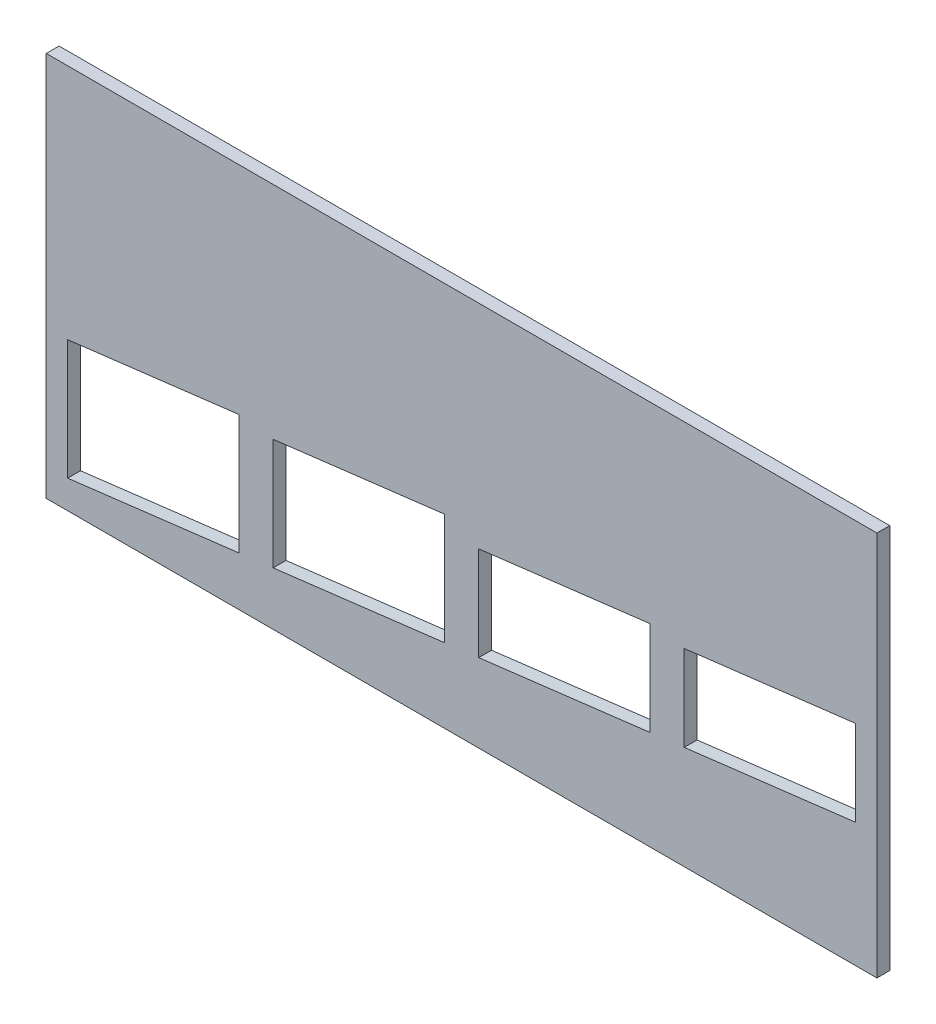
ISO-10303-21;
HEADER;
FILE_DESCRIPTION(('STEP AP214'),'2;1');
FILE_NAME('part.step','',(''),(''),'','','');
FILE_SCHEMA(('AUTOMOTIVE_DESIGN { 1 0 10303 214 1 1 1 1 }'));
ENDSEC;
DATA;
#1=APPLICATION_CONTEXT('core data for automotive mechanical design processes');
#2=APPLICATION_PROTOCOL_DEFINITION('international standard','automotive_design',2000,#1);
#3=PRODUCT_CONTEXT('',#1,'mechanical');
#4=PRODUCT('Part','Part','',(#3));
#5=PRODUCT_RELATED_PRODUCT_CATEGORY('part','',(#4));
#6=PRODUCT_DEFINITION_FORMATION('','',#4);
#7=PRODUCT_DEFINITION_CONTEXT('part definition',#1,'design');
#8=PRODUCT_DEFINITION('design','',#6,#7);
#9=PRODUCT_DEFINITION_SHAPE('','',#8);
#10=(LENGTH_UNIT() NAMED_UNIT(*) SI_UNIT(.MILLI.,.METRE.));
#11=(NAMED_UNIT(*) PLANE_ANGLE_UNIT() SI_UNIT($,.RADIAN.));
#12=(NAMED_UNIT(*) SI_UNIT($,.STERADIAN.) SOLID_ANGLE_UNIT());
#13=UNCERTAINTY_MEASURE_WITH_UNIT(LENGTH_MEASURE(1.E-05),#10,'distance_accuracy_value','');
#14=(GEOMETRIC_REPRESENTATION_CONTEXT(3) GLOBAL_UNCERTAINTY_ASSIGNED_CONTEXT((#13)) GLOBAL_UNIT_ASSIGNED_CONTEXT((#10,
#11,#12)) REPRESENTATION_CONTEXT('',''));
#15=CARTESIAN_POINT('',(0.,0.,0.));
#16=DIRECTION('',(0.,0.,1.));
#17=DIRECTION('',(1.,0.,0.));
#18=AXIS2_PLACEMENT_3D('',#15,#16,#17);
#19=CARTESIAN_POINT('',(0.,45.0091370558375,3.));
#20=DIRECTION('',(0.,1.,0.));
#21=DIRECTION('',(0.,0.,1.));
#22=AXIS2_PLACEMENT_3D('',#19,#20,#21);
#23=PLANE('',#22);
#24=DIRECTION('',(1.,0.,0.));
#25=VECTOR('',#24,1.);
#26=CARTESIAN_POINT('',(0.,45.0091370558375,0.));
#27=LINE('',#26,#25);
#28=CARTESIAN_POINT('',(-98.5,45.0091370558375,0.));
#29=VERTEX_POINT('',#28);
#30=CARTESIAN_POINT('',(95.5,45.0091370558375,0.));
#31=VERTEX_POINT('',#30);
#32=EDGE_CURVE('E292',#29,#31,#27,.T.);
#33=ORIENTED_EDGE('',*,*,#32,.F.);
#34=DIRECTION('',(0.,0.,-1.));
#35=VECTOR('',#34,1.);
#36=CARTESIAN_POINT('',(-98.5,45.0091370558375,3.));
#37=LINE('',#36,#35);
#38=CARTESIAN_POINT('',(-98.5,45.0091370558375,3.));
#39=VERTEX_POINT('',#38);
#40=EDGE_CURVE('E11',#39,#29,#37,.T.);
#41=ORIENTED_EDGE('',*,*,#40,.F.);
#42=DIRECTION('',(1.,0.,0.));
#43=VECTOR('',#42,1.);
#44=CARTESIAN_POINT('',(0.,45.0091370558375,3.));
#45=LINE('',#44,#43);
#46=CARTESIAN_POINT('',(95.5,45.0091370558375,3.));
#47=VERTEX_POINT('',#46);
#48=EDGE_CURVE('E191',#39,#47,#45,.T.);
#49=ORIENTED_EDGE('',*,*,#48,.T.);
#50=DIRECTION('',(0.,0.,-1.));
#51=VECTOR('',#50,1.);
#52=CARTESIAN_POINT('',(95.5,45.0091370558375,3.));
#53=LINE('',#52,#51);
#54=EDGE_CURVE('E52',#47,#31,#53,.T.);
#55=ORIENTED_EDGE('',*,*,#54,.T.);
#56=EDGE_LOOP('',(#33,#41,#49,#55));
#57=FACE_BOUND('',#56,.T.);
#58=ADVANCED_FACE('F33',(#57),#23,.T.);
#59=CARTESIAN_POINT('',(-98.5,0.,3.));
#60=DIRECTION('',(1.,0.,0.));
#61=DIRECTION('',(0.,0.,-1.));
#62=AXIS2_PLACEMENT_3D('',#59,#60,#61);
#63=PLANE('',#62);
#64=DIRECTION('',(0.,-1.,0.));
#65=VECTOR('',#64,1.);
#66=CARTESIAN_POINT('',(-98.5,0.,0.));
#67=LINE('',#66,#65);
#68=CARTESIAN_POINT('',(-98.5,-44.9908629441625,0.));
#69=VERTEX_POINT('',#68);
#70=EDGE_CURVE('E196',#29,#69,#67,.T.);
#71=ORIENTED_EDGE('',*,*,#70,.T.);
#72=DIRECTION('',(0.,0.,-1.));
#73=VECTOR('',#72,1.);
#74=CARTESIAN_POINT('',(-98.5,-44.9908629441625,3.));
#75=LINE('',#74,#73);
#76=CARTESIAN_POINT('',(-98.5,-44.9908629441625,3.));
#77=VERTEX_POINT('',#76);
#78=EDGE_CURVE('E43',#77,#69,#75,.T.);
#79=ORIENTED_EDGE('',*,*,#78,.F.);
#80=DIRECTION('',(0.,-1.,0.));
#81=VECTOR('',#80,1.);
#82=CARTESIAN_POINT('',(-98.5,0.,3.));
#83=LINE('',#82,#81);
#84=EDGE_CURVE('E186',#39,#77,#83,.T.);
#85=ORIENTED_EDGE('',*,*,#84,.F.);
#86=ORIENTED_EDGE('',*,*,#40,.T.);
#87=EDGE_LOOP('',(#71,#79,#85,#86));
#88=FACE_BOUND('',#87,.T.);
#89=ADVANCED_FACE('F194',(#88),#63,.F.);
#90=CARTESIAN_POINT('',(0.,-44.9908629441625,3.));
#91=DIRECTION('',(0.,1.,0.));
#92=DIRECTION('',(-1.,0.,0.));
#93=AXIS2_PLACEMENT_3D('',#90,#91,#92);
#94=PLANE('',#93);
#95=DIRECTION('',(1.,0.,0.));
#96=VECTOR('',#95,1.);
#97=CARTESIAN_POINT('',(0.,-44.9908629441625,0.));
#98=LINE('',#97,#96);
#99=CARTESIAN_POINT('',(95.5,-44.9908629441625,0.));
#100=VERTEX_POINT('',#99);
#101=EDGE_CURVE('E295',#69,#100,#98,.T.);
#102=ORIENTED_EDGE('',*,*,#101,.T.);
#103=DIRECTION('',(0.,0.,-1.));
#104=VECTOR('',#103,1.);
#105=CARTESIAN_POINT('',(95.5,-44.9908629441625,3.));
#106=LINE('',#105,#104);
#107=CARTESIAN_POINT('',(95.5,-44.9908629441625,3.));
#108=VERTEX_POINT('',#107);
#109=EDGE_CURVE('E114',#108,#100,#106,.T.);
#110=ORIENTED_EDGE('',*,*,#109,.F.);
#111=DIRECTION('',(1.,0.,0.));
#112=VECTOR('',#111,1.);
#113=CARTESIAN_POINT('',(0.,-44.9908629441625,3.));
#114=LINE('',#113,#112);
#115=EDGE_CURVE('E178',#77,#108,#114,.T.);
#116=ORIENTED_EDGE('',*,*,#115,.F.);
#117=ORIENTED_EDGE('',*,*,#78,.T.);
#118=EDGE_LOOP('',(#102,#110,#116,#117));
#119=FACE_BOUND('',#118,.T.);
#120=ADVANCED_FACE('F180',(#119),#94,.F.);
#121=CARTESIAN_POINT('',(-93.5,0.,3.));
#122=DIRECTION('',(-1.,0.,0.));
#123=DIRECTION('',(0.,0.,1.));
#124=AXIS2_PLACEMENT_3D('',#121,#122,#123);
#125=PLANE('',#124);
#126=DIRECTION('',(0.,1.,0.));
#127=VECTOR('',#126,1.);
#128=CARTESIAN_POINT('',(-93.5,0.,0.));
#129=LINE('',#128,#127);
#130=CARTESIAN_POINT('',(-93.5,-38.3908629441625,0.));
#131=VERTEX_POINT('',#130);
#132=CARTESIAN_POINT('',(-93.5,-10.3908629441625,0.));
#133=VERTEX_POINT('',#132);
#134=EDGE_CURVE('E280',#131,#133,#129,.T.);
#135=ORIENTED_EDGE('',*,*,#134,.T.);
#136=DIRECTION('',(0.,0.,-1.));
#137=VECTOR('',#136,1.);
#138=CARTESIAN_POINT('',(-93.5,-10.3908629441625,3.));
#139=LINE('',#138,#137);
#140=CARTESIAN_POINT('',(-93.5,-10.3908629441625,3.));
#141=VERTEX_POINT('',#140);
#142=EDGE_CURVE('E208',#141,#133,#139,.T.);
#143=ORIENTED_EDGE('',*,*,#142,.F.);
#144=DIRECTION('',(0.,1.,0.));
#145=VECTOR('',#144,1.);
#146=CARTESIAN_POINT('',(-93.5,0.,3.));
#147=LINE('',#146,#145);
#148=CARTESIAN_POINT('',(-93.5,-38.3908629441625,3.));
#149=VERTEX_POINT('',#148);
#150=EDGE_CURVE('E333',#149,#141,#147,.T.);
#151=ORIENTED_EDGE('',*,*,#150,.F.);
#152=DIRECTION('',(0.,0.,-1.));
#153=VECTOR('',#152,1.);
#154=CARTESIAN_POINT('',(-93.5,-38.3908629441625,3.));
#155=LINE('',#154,#153);
#156=EDGE_CURVE('E201',#149,#131,#155,.T.);
#157=ORIENTED_EDGE('',*,*,#156,.T.);
#158=EDGE_LOOP('',(#135,#143,#151,#157));
#159=FACE_BOUND('',#158,.T.);
#160=ADVANCED_FACE('F380',(#159),#125,.F.);
#161=CARTESIAN_POINT('',(-0.120045702678682,0.98537514282085,3.));
#162=DIRECTION('',(-0.120933275731409,0.992660638295319,0.));
#163=DIRECTION('',(-0.992660638295319,-0.120933275731409,0.));
#164=AXIS2_PLACEMENT_3D('',#161,#162,#163);
#165=PLANE('',#164);
#166=DIRECTION('',(0.992660638295319,0.120933275731409,0.));
#167=VECTOR('',#166,1.);
#168=CARTESIAN_POINT('',(-0.120045702678682,0.98537514282085,0.));
#169=LINE('',#168,#167);
#170=CARTESIAN_POINT('',(-53.5,-5.51776649746195,0.));
#171=VERTEX_POINT('',#170);
#172=EDGE_CURVE('E283',#133,#171,#169,.T.);
#173=ORIENTED_EDGE('',*,*,#172,.T.);
#174=DIRECTION('',(0.,0.,-1.));
#175=VECTOR('',#174,1.);
#176=CARTESIAN_POINT('',(-53.5,-5.51776649746195,3.));
#177=LINE('',#176,#175);
#178=CARTESIAN_POINT('',(-53.5,-5.51776649746195,3.));
#179=VERTEX_POINT('',#178);
#180=EDGE_CURVE('E206',#179,#171,#177,.T.);
#181=ORIENTED_EDGE('',*,*,#180,.F.);
#182=DIRECTION('',(0.992660638295319,0.120933275731409,0.));
#183=VECTOR('',#182,1.);
#184=CARTESIAN_POINT('',(-0.120045702678682,0.98537514282085,3.));
#185=LINE('',#184,#183);
#186=EDGE_CURVE('E336',#141,#179,#185,.T.);
#187=ORIENTED_EDGE('',*,*,#186,.F.);
#188=ORIENTED_EDGE('',*,*,#142,.T.);
#189=EDGE_LOOP('',(#173,#181,#187,#188));
#190=FACE_BOUND('',#189,.T.);
#191=ADVANCED_FACE('F376',(#190),#165,.F.);
#192=CARTESIAN_POINT('',(-53.5,0.,3.));
#193=DIRECTION('',(-1.,0.,0.));
#194=DIRECTION('',(0.,-1.,0.));
#195=AXIS2_PLACEMENT_3D('',#192,#193,#194);
#196=PLANE('',#195);
#197=DIRECTION('',(0.,1.,0.));
#198=VECTOR('',#197,1.);
#199=CARTESIAN_POINT('',(-53.5,0.,0.));
#200=LINE('',#199,#198);
#201=CARTESIAN_POINT('',(-53.5,-33.5177664974619,0.));
#202=VERTEX_POINT('',#201);
#203=EDGE_CURVE('E286',#202,#171,#200,.T.);
#204=ORIENTED_EDGE('',*,*,#203,.F.);
#205=DIRECTION('',(0.,0.,-1.));
#206=VECTOR('',#205,1.);
#207=CARTESIAN_POINT('',(-53.5,-33.5177664974619,3.));
#208=LINE('',#207,#206);
#209=CARTESIAN_POINT('',(-53.5,-33.5177664974619,3.));
#210=VERTEX_POINT('',#209);
#211=EDGE_CURVE('E203',#210,#202,#208,.T.);
#212=ORIENTED_EDGE('',*,*,#211,.F.);
#213=DIRECTION('',(0.,1.,0.));
#214=VECTOR('',#213,1.);
#215=CARTESIAN_POINT('',(-53.5,0.,3.));
#216=LINE('',#215,#214);
#217=EDGE_CURVE('E338',#210,#179,#216,.T.);
#218=ORIENTED_EDGE('',*,*,#217,.T.);
#219=ORIENTED_EDGE('',*,*,#180,.T.);
#220=EDGE_LOOP('',(#204,#212,#218,#219));
#221=FACE_BOUND('',#220,.T.);
#222=ADVANCED_FACE('F372',(#221),#196,.T.);
#223=CARTESIAN_POINT('',(-45.5,0.,3.));
#224=DIRECTION('',(-1.,0.,0.));
#225=DIRECTION('',(0.,-1.,0.));
#226=AXIS2_PLACEMENT_3D('',#223,#224,#225);
#227=PLANE('',#226);
#228=DIRECTION('',(0.,1.,0.));
#229=VECTOR('',#228,1.);
#230=CARTESIAN_POINT('',(-45.5,0.,0.));
#231=LINE('',#230,#229);
#232=CARTESIAN_POINT('',(-45.5,-32.5431472081218,0.));
#233=VERTEX_POINT('',#232);
#234=CARTESIAN_POINT('',(-45.5,-6.54314720812184,0.));
#235=VERTEX_POINT('',#234);
#236=EDGE_CURVE('E268',#233,#235,#231,.T.);
#237=ORIENTED_EDGE('',*,*,#236,.T.);
#238=DIRECTION('',(0.,0.,-1.));
#239=VECTOR('',#238,1.);
#240=CARTESIAN_POINT('',(-45.5,-6.54314720812184,3.));
#241=LINE('',#240,#239);
#242=CARTESIAN_POINT('',(-45.5,-6.54314720812184,3.));
#243=VERTEX_POINT('',#242);
#244=EDGE_CURVE('E204',#243,#235,#241,.T.);
#245=ORIENTED_EDGE('',*,*,#244,.F.);
#246=DIRECTION('',(0.,1.,0.));
#247=VECTOR('',#246,1.);
#248=CARTESIAN_POINT('',(-45.5,0.,3.));
#249=LINE('',#248,#247);
#250=CARTESIAN_POINT('',(-45.5,-32.5431472081218,3.));
#251=VERTEX_POINT('',#250);
#252=EDGE_CURVE('E322',#251,#243,#249,.T.);
#253=ORIENTED_EDGE('',*,*,#252,.F.);
#254=DIRECTION('',(0.,0.,-1.));
#255=VECTOR('',#254,1.);
#256=CARTESIAN_POINT('',(-45.5,-32.5431472081218,3.));
#257=LINE('',#256,#255);
#258=EDGE_CURVE('E211',#251,#233,#257,.T.);
#259=ORIENTED_EDGE('',*,*,#258,.T.);
#260=EDGE_LOOP('',(#237,#245,#253,#259));
#261=FACE_BOUND('',#260,.T.);
#262=ADVANCED_FACE('F375',(#261),#227,.F.);
#263=CARTESIAN_POINT('',(0.120045702678687,-0.985375142820888,3.));
#264=DIRECTION('',(-0.120933275731409,0.992660638295319,0.));
#265=DIRECTION('',(-0.992660638295319,-0.120933275731409,0.));
#266=AXIS2_PLACEMENT_3D('',#263,#264,#265);
#267=PLANE('',#266);
#268=DIRECTION('',(0.992660638295319,0.120933275731409,0.));
#269=VECTOR('',#268,1.);
#270=CARTESIAN_POINT('',(0.120045702678687,-0.985375142820888,0.));
#271=LINE('',#270,#269);
#272=CARTESIAN_POINT('',(-5.49999999999999,-1.67005076142134,0.));
#273=VERTEX_POINT('',#272);
#274=EDGE_CURVE('E271',#235,#273,#271,.T.);
#275=ORIENTED_EDGE('',*,*,#274,.T.);
#276=DIRECTION('',(0.,0.,-1.));
#277=VECTOR('',#276,1.);
#278=CARTESIAN_POINT('',(-5.49999999999999,-1.67005076142134,3.));
#279=LINE('',#278,#277);
#280=CARTESIAN_POINT('',(-5.49999999999999,-1.67005076142134,3.));
#281=VERTEX_POINT('',#280);
#282=EDGE_CURVE('E216',#281,#273,#279,.T.);
#283=ORIENTED_EDGE('',*,*,#282,.F.);
#284=DIRECTION('',(0.992660638295319,0.120933275731409,0.));
#285=VECTOR('',#284,1.);
#286=CARTESIAN_POINT('',(0.120045702678687,-0.985375142820888,3.));
#287=LINE('',#286,#285);
#288=EDGE_CURVE('E325',#243,#281,#287,.T.);
#289=ORIENTED_EDGE('',*,*,#288,.F.);
#290=ORIENTED_EDGE('',*,*,#244,.T.);
#291=EDGE_LOOP('',(#275,#283,#289,#290));
#292=FACE_BOUND('',#291,.T.);
#293=ADVANCED_FACE('F392',(#292),#267,.F.);
#294=CARTESIAN_POINT('',(-5.49999999999999,0.,3.));
#295=DIRECTION('',(-1.,0.,0.));
#296=DIRECTION('',(0.,-1.,0.));
#297=AXIS2_PLACEMENT_3D('',#294,#295,#296);
#298=PLANE('',#297);
#299=DIRECTION('',(0.,1.,0.));
#300=VECTOR('',#299,1.);
#301=CARTESIAN_POINT('',(-5.49999999999999,0.,0.));
#302=LINE('',#301,#300);
#303=CARTESIAN_POINT('',(-5.49999999999998,-27.6700507614213,0.));
#304=VERTEX_POINT('',#303);
#305=EDGE_CURVE('E274',#304,#273,#302,.T.);
#306=ORIENTED_EDGE('',*,*,#305,.F.);
#307=DIRECTION('',(0.,0.,-1.));
#308=VECTOR('',#307,1.);
#309=CARTESIAN_POINT('',(-5.49999999999998,-27.6700507614213,3.));
#310=LINE('',#309,#308);
#311=CARTESIAN_POINT('',(-5.49999999999998,-27.6700507614213,3.));
#312=VERTEX_POINT('',#311);
#313=EDGE_CURVE('E213',#312,#304,#310,.T.);
#314=ORIENTED_EDGE('',*,*,#313,.F.);
#315=DIRECTION('',(0.,1.,0.));
#316=VECTOR('',#315,1.);
#317=CARTESIAN_POINT('',(-5.49999999999999,0.,3.));
#318=LINE('',#317,#316);
#319=EDGE_CURVE('E327',#312,#281,#318,.T.);
#320=ORIENTED_EDGE('',*,*,#319,.T.);
#321=ORIENTED_EDGE('',*,*,#282,.T.);
#322=EDGE_LOOP('',(#306,#314,#320,#321));
#323=FACE_BOUND('',#322,.T.);
#324=ADVANCED_FACE('F388',(#323),#298,.T.);
#325=CARTESIAN_POINT('',(2.50000000000001,0.,3.));
#326=DIRECTION('',(-1.,0.,0.));
#327=DIRECTION('',(0.,-1.,0.));
#328=AXIS2_PLACEMENT_3D('',#325,#326,#327);
#329=PLANE('',#328);
#330=DIRECTION('',(0.,1.,0.));
#331=VECTOR('',#330,1.);
#332=CARTESIAN_POINT('',(2.50000000000001,0.,0.));
#333=LINE('',#332,#331);
#334=CARTESIAN_POINT('',(2.50000000000002,-26.6954314720812,0.));
#335=VERTEX_POINT('',#334);
#336=CARTESIAN_POINT('',(2.50000000000001,-4.69543147208123,0.));
#337=VERTEX_POINT('',#336);
#338=EDGE_CURVE('E256',#335,#337,#333,.T.);
#339=ORIENTED_EDGE('',*,*,#338,.T.);
#340=DIRECTION('',(0.,0.,-1.));
#341=VECTOR('',#340,1.);
#342=CARTESIAN_POINT('',(2.50000000000001,-4.69543147208123,3.));
#343=LINE('',#342,#341);
#344=CARTESIAN_POINT('',(2.50000000000001,-4.69543147208123,3.));
#345=VERTEX_POINT('',#344);
#346=EDGE_CURVE('E214',#345,#337,#343,.T.);
#347=ORIENTED_EDGE('',*,*,#346,.F.);
#348=DIRECTION('',(0.,1.,0.));
#349=VECTOR('',#348,1.);
#350=CARTESIAN_POINT('',(2.50000000000001,0.,3.));
#351=LINE('',#350,#349);
#352=CARTESIAN_POINT('',(2.50000000000002,-26.6954314720812,3.));
#353=VERTEX_POINT('',#352);
#354=EDGE_CURVE('E311',#353,#345,#351,.T.);
#355=ORIENTED_EDGE('',*,*,#354,.F.);
#356=DIRECTION('',(0.,0.,-1.));
#357=VECTOR('',#356,1.);
#358=CARTESIAN_POINT('',(2.50000000000002,-26.6954314720812,3.));
#359=LINE('',#358,#357);
#360=EDGE_CURVE('E220',#353,#335,#359,.T.);
#361=ORIENTED_EDGE('',*,*,#360,.T.);
#362=EDGE_LOOP('',(#339,#347,#355,#361));
#363=FACE_BOUND('',#362,.T.);
#364=ADVANCED_FACE('F391',(#363),#329,.F.);
#365=CARTESIAN_POINT('',(0.600228513393426,-4.92687571410437,3.));
#366=DIRECTION('',(-0.120933275731409,0.992660638295319,0.));
#367=DIRECTION('',(-0.992660638295319,-0.120933275731409,0.));
#368=AXIS2_PLACEMENT_3D('',#365,#366,#367);
#369=PLANE('',#368);
#370=DIRECTION('',(0.992660638295319,0.120933275731409,0.));
#371=VECTOR('',#370,1.);
#372=CARTESIAN_POINT('',(0.600228513393426,-4.92687571410437,0.));
#373=LINE('',#372,#371);
#374=CARTESIAN_POINT('',(42.5,0.177664974619275,0.));
#375=VERTEX_POINT('',#374);
#376=EDGE_CURVE('E259',#337,#375,#373,.T.);
#377=ORIENTED_EDGE('',*,*,#376,.T.);
#378=DIRECTION('',(0.,0.,-1.));
#379=VECTOR('',#378,1.);
#380=CARTESIAN_POINT('',(42.5,0.177664974619275,3.));
#381=LINE('',#380,#379);
#382=CARTESIAN_POINT('',(42.5,0.177664974619275,3.));
#383=VERTEX_POINT('',#382);
#384=EDGE_CURVE('E224',#383,#375,#381,.T.);
#385=ORIENTED_EDGE('',*,*,#384,.F.);
#386=DIRECTION('',(0.992660638295319,0.120933275731409,0.));
#387=VECTOR('',#386,1.);
#388=CARTESIAN_POINT('',(0.600228513393426,-4.92687571410437,3.));
#389=LINE('',#388,#387);
#390=EDGE_CURVE('E314',#345,#383,#389,.T.);
#391=ORIENTED_EDGE('',*,*,#390,.F.);
#392=ORIENTED_EDGE('',*,*,#346,.T.);
#393=EDGE_LOOP('',(#377,#385,#391,#392));
#394=FACE_BOUND('',#393,.T.);
#395=ADVANCED_FACE('F406',(#394),#369,.F.);
#396=CARTESIAN_POINT('',(42.5,0.,3.));
#397=DIRECTION('',(-1.,0.,0.));
#398=DIRECTION('',(0.,-1.,0.));
#399=AXIS2_PLACEMENT_3D('',#396,#397,#398);
#400=PLANE('',#399);
#401=DIRECTION('',(0.,1.,0.));
#402=VECTOR('',#401,1.);
#403=CARTESIAN_POINT('',(42.5,0.,0.));
#404=LINE('',#403,#402);
#405=CARTESIAN_POINT('',(42.5,-21.8223350253807,0.));
#406=VERTEX_POINT('',#405);
#407=EDGE_CURVE('E262',#406,#375,#404,.T.);
#408=ORIENTED_EDGE('',*,*,#407,.F.);
#409=DIRECTION('',(0.,0.,-1.));
#410=VECTOR('',#409,1.);
#411=CARTESIAN_POINT('',(42.5,-21.8223350253807,3.));
#412=LINE('',#411,#410);
#413=CARTESIAN_POINT('',(42.5,-21.8223350253807,3.));
#414=VERTEX_POINT('',#413);
#415=EDGE_CURVE('E222',#414,#406,#412,.T.);
#416=ORIENTED_EDGE('',*,*,#415,.F.);
#417=DIRECTION('',(0.,1.,0.));
#418=VECTOR('',#417,1.);
#419=CARTESIAN_POINT('',(42.5,0.,3.));
#420=LINE('',#419,#418);
#421=EDGE_CURVE('E316',#414,#383,#420,.T.);
#422=ORIENTED_EDGE('',*,*,#421,.T.);
#423=ORIENTED_EDGE('',*,*,#384,.T.);
#424=EDGE_LOOP('',(#408,#416,#422,#423));
#425=FACE_BOUND('',#424,.T.);
#426=ADVANCED_FACE('F403',(#425),#400,.T.);
#427=CARTESIAN_POINT('',(50.5,0.,3.));
#428=DIRECTION('',(-1.,0.,0.));
#429=DIRECTION('',(0.,-1.,0.));
#430=AXIS2_PLACEMENT_3D('',#427,#428,#429);
#431=PLANE('',#430);
#432=DIRECTION('',(0.,1.,0.));
#433=VECTOR('',#432,1.);
#434=CARTESIAN_POINT('',(50.5,0.,0.));
#435=LINE('',#434,#433);
#436=CARTESIAN_POINT('',(50.5,-20.8477157360406,0.));
#437=VERTEX_POINT('',#436);
#438=CARTESIAN_POINT('',(50.5,-0.847715736040624,0.));
#439=VERTEX_POINT('',#438);
#440=EDGE_CURVE('E244',#437,#439,#435,.T.);
#441=ORIENTED_EDGE('',*,*,#440,.T.);
#442=DIRECTION('',(0.,0.,-1.));
#443=VECTOR('',#442,1.);
#444=CARTESIAN_POINT('',(50.5,-0.847715736040624,3.));
#445=LINE('',#444,#443);
#446=CARTESIAN_POINT('',(50.5,-0.847715736040624,3.));
#447=VERTEX_POINT('',#446);
#448=EDGE_CURVE('E37',#447,#439,#445,.T.);
#449=ORIENTED_EDGE('',*,*,#448,.F.);
#450=DIRECTION('',(0.,1.,0.));
#451=VECTOR('',#450,1.);
#452=CARTESIAN_POINT('',(50.5,0.,3.));
#453=LINE('',#452,#451);
#454=CARTESIAN_POINT('',(50.5,-20.8477157360406,3.));
#455=VERTEX_POINT('',#454);
#456=EDGE_CURVE('E299',#455,#447,#453,.T.);
#457=ORIENTED_EDGE('',*,*,#456,.F.);
#458=DIRECTION('',(0.,0.,-1.));
#459=VECTOR('',#458,1.);
#460=CARTESIAN_POINT('',(50.5,-20.8477157360406,3.));
#461=LINE('',#460,#459);
#462=EDGE_CURVE('E228',#455,#437,#461,.T.);
#463=ORIENTED_EDGE('',*,*,#462,.T.);
#464=EDGE_LOOP('',(#441,#449,#457,#463));
#465=FACE_BOUND('',#464,.T.);
#466=ADVANCED_FACE('F35',(#465),#431,.F.);
#467=CARTESIAN_POINT('',(0.835146497844717,-6.8780877957947,3.));
#468=DIRECTION('',(-0.120536031235745,0.992708952903083,0.));
#469=DIRECTION('',(-0.992708952903083,-0.120536031235745,0.));
#470=AXIS2_PLACEMENT_3D('',#467,#468,#469);
#471=PLANE('',#470);
#472=DIRECTION('',(0.992708952903083,0.120536031235745,0.));
#473=VECTOR('',#472,1.);
#474=CARTESIAN_POINT('',(0.835146497844717,-6.8780877957947,0.));
#475=LINE('',#474,#473);
#476=CARTESIAN_POINT('',(90.5,4.00913705583755,0.));
#477=VERTEX_POINT('',#476);
#478=EDGE_CURVE('E239',#439,#477,#475,.T.);
#479=ORIENTED_EDGE('',*,*,#478,.T.);
#480=DIRECTION('',(0.,0.,-1.));
#481=VECTOR('',#480,1.);
#482=CARTESIAN_POINT('',(90.5,4.00913705583755,3.));
#483=LINE('',#482,#481);
#484=CARTESIAN_POINT('',(90.5,4.00913705583755,3.));
#485=VERTEX_POINT('',#484);
#486=EDGE_CURVE('E231',#485,#477,#483,.T.);
#487=ORIENTED_EDGE('',*,*,#486,.F.);
#488=DIRECTION('',(0.992708952903083,0.120536031235745,0.));
#489=VECTOR('',#488,1.);
#490=CARTESIAN_POINT('',(0.835146497844717,-6.8780877957947,3.));
#491=LINE('',#490,#489);
#492=EDGE_CURVE('E127',#447,#485,#491,.T.);
#493=ORIENTED_EDGE('',*,*,#492,.F.);
#494=ORIENTED_EDGE('',*,*,#448,.T.);
#495=EDGE_LOOP('',(#479,#487,#493,#494));
#496=FACE_BOUND('',#495,.T.);
#497=ADVANCED_FACE('F238',(#496),#471,.F.);
#498=CARTESIAN_POINT('',(90.5,0.,3.));
#499=DIRECTION('',(-1.,0.,0.));
#500=DIRECTION('',(0.,-1.,0.));
#501=AXIS2_PLACEMENT_3D('',#498,#499,#500);
#502=PLANE('',#501);
#503=DIRECTION('',(0.,1.,0.));
#504=VECTOR('',#503,1.);
#505=CARTESIAN_POINT('',(90.5,0.,0.));
#506=LINE('',#505,#504);
#507=CARTESIAN_POINT('',(90.5,-15.9908629441625,0.));
#508=VERTEX_POINT('',#507);
#509=EDGE_CURVE('E249',#508,#477,#506,.T.);
#510=ORIENTED_EDGE('',*,*,#509,.F.);
#511=DIRECTION('',(0.,0.,-1.));
#512=VECTOR('',#511,1.);
#513=CARTESIAN_POINT('',(90.5,-15.9908629441625,3.));
#514=LINE('',#513,#512);
#515=CARTESIAN_POINT('',(90.5,-15.9908629441625,3.));
#516=VERTEX_POINT('',#515);
#517=EDGE_CURVE('E230',#516,#508,#514,.T.);
#518=ORIENTED_EDGE('',*,*,#517,.F.);
#519=DIRECTION('',(0.,1.,0.));
#520=VECTOR('',#519,1.);
#521=CARTESIAN_POINT('',(90.5,0.,3.));
#522=LINE('',#521,#520);
#523=EDGE_CURVE('E304',#516,#485,#522,.T.);
#524=ORIENTED_EDGE('',*,*,#523,.T.);
#525=ORIENTED_EDGE('',*,*,#486,.T.);
#526=EDGE_LOOP('',(#510,#518,#524,#525));
#527=FACE_BOUND('',#526,.T.);
#528=ADVANCED_FACE('F370',(#527),#502,.T.);
#529=CARTESIAN_POINT('',(3.24123397232449,-26.6051288561635,3.));
#530=DIRECTION('',(-0.12093327573141,0.992660638295319,0.));
#531=DIRECTION('',(-0.992660638295319,-0.12093327573141,0.));
#532=AXIS2_PLACEMENT_3D('',#529,#530,#531);
#533=PLANE('',#532);
#534=DIRECTION('',(0.992660638295319,0.12093327573141,0.));
#535=VECTOR('',#534,1.);
#536=CARTESIAN_POINT('',(3.24123397232449,-26.6051288561635,0.));
#537=LINE('',#536,#535);
#538=EDGE_CURVE('E289',#131,#202,#537,.T.);
#539=ORIENTED_EDGE('',*,*,#538,.F.);
#540=ORIENTED_EDGE('',*,*,#156,.F.);
#541=DIRECTION('',(0.992660638295319,0.12093327573141,0.));
#542=VECTOR('',#541,1.);
#543=CARTESIAN_POINT('',(3.24123397232449,-26.6051288561635,3.));
#544=LINE('',#543,#542);
#545=EDGE_CURVE('E341',#149,#210,#544,.T.);
#546=ORIENTED_EDGE('',*,*,#545,.T.);
#547=ORIENTED_EDGE('',*,*,#211,.T.);
#548=EDGE_LOOP('',(#539,#540,#546,#547));
#549=FACE_BOUND('',#548,.T.);
#550=ADVANCED_FACE('F366',(#549),#533,.T.);
#551=CARTESIAN_POINT('',(3.24123397232449,-26.6051288561635,3.));
#552=DIRECTION('',(-0.120933275731409,0.992660638295319,0.));
#553=DIRECTION('',(-0.992660638295319,-0.120933275731409,0.));
#554=AXIS2_PLACEMENT_3D('',#551,#552,#553);
#555=PLANE('',#554);
#556=DIRECTION('',(0.992660638295319,0.120933275731409,0.));
#557=VECTOR('',#556,1.);
#558=CARTESIAN_POINT('',(3.24123397232449,-26.6051288561635,0.));
#559=LINE('',#558,#557);
#560=EDGE_CURVE('E277',#233,#304,#559,.T.);
#561=ORIENTED_EDGE('',*,*,#560,.F.);
#562=ORIENTED_EDGE('',*,*,#258,.F.);
#563=DIRECTION('',(0.992660638295319,0.120933275731409,0.));
#564=VECTOR('',#563,1.);
#565=CARTESIAN_POINT('',(3.24123397232449,-26.6051288561635,3.));
#566=LINE('',#565,#564);
#567=EDGE_CURVE('E330',#251,#312,#566,.T.);
#568=ORIENTED_EDGE('',*,*,#567,.T.);
#569=ORIENTED_EDGE('',*,*,#313,.T.);
#570=EDGE_LOOP('',(#561,#562,#568,#569));
#571=FACE_BOUND('',#570,.T.);
#572=ADVANCED_FACE('F369',(#571),#555,.T.);
#573=CARTESIAN_POINT('',(3.24123397232449,-26.6051288561635,3.));
#574=DIRECTION('',(-0.12093327573141,0.992660638295319,0.));
#575=DIRECTION('',(-0.992660638295319,-0.12093327573141,0.));
#576=AXIS2_PLACEMENT_3D('',#573,#574,#575);
#577=PLANE('',#576);
#578=DIRECTION('',(0.992660638295319,0.12093327573141,0.));
#579=VECTOR('',#578,1.);
#580=CARTESIAN_POINT('',(3.24123397232449,-26.6051288561635,0.));
#581=LINE('',#580,#579);
#582=EDGE_CURVE('E265',#335,#406,#581,.T.);
#583=ORIENTED_EDGE('',*,*,#582,.F.);
#584=ORIENTED_EDGE('',*,*,#360,.F.);
#585=DIRECTION('',(0.992660638295319,0.12093327573141,0.));
#586=VECTOR('',#585,1.);
#587=CARTESIAN_POINT('',(3.24123397232449,-26.6051288561635,3.));
#588=LINE('',#587,#586);
#589=EDGE_CURVE('E319',#353,#414,#588,.T.);
#590=ORIENTED_EDGE('',*,*,#589,.T.);
#591=ORIENTED_EDGE('',*,*,#415,.T.);
#592=EDGE_LOOP('',(#583,#584,#590,#591));
#593=FACE_BOUND('',#592,.T.);
#594=ADVANCED_FACE('F354',(#593),#577,.T.);
#595=CARTESIAN_POINT('',(3.22829044494731,-26.5875090992734,3.));
#596=DIRECTION('',(-0.120536031235745,0.992708952903083,0.));
#597=DIRECTION('',(-0.992708952903083,-0.120536031235745,0.));
#598=AXIS2_PLACEMENT_3D('',#595,#596,#597);
#599=PLANE('',#598);
#600=DIRECTION('',(0.992708952903083,0.120536031235745,0.));
#601=VECTOR('',#600,1.);
#602=CARTESIAN_POINT('',(3.22829044494731,-26.5875090992734,0.));
#603=LINE('',#602,#601);
#604=EDGE_CURVE('E254',#437,#508,#603,.T.);
#605=ORIENTED_EDGE('',*,*,#604,.F.);
#606=ORIENTED_EDGE('',*,*,#462,.F.);
#607=DIRECTION('',(0.992708952903083,0.120536031235745,0.));
#608=VECTOR('',#607,1.);
#609=CARTESIAN_POINT('',(3.22829044494731,-26.5875090992734,3.));
#610=LINE('',#609,#608);
#611=EDGE_CURVE('E308',#455,#516,#610,.T.);
#612=ORIENTED_EDGE('',*,*,#611,.T.);
#613=ORIENTED_EDGE('',*,*,#517,.T.);
#614=EDGE_LOOP('',(#605,#606,#612,#613));
#615=FACE_BOUND('',#614,.T.);
#616=ADVANCED_FACE('F346',(#615),#599,.T.);
#617=CARTESIAN_POINT('',(95.5,0.,3.));
#618=DIRECTION('',(1.,0.,0.));
#619=DIRECTION('',(0.,1.,0.));
#620=AXIS2_PLACEMENT_3D('',#617,#618,#619);
#621=PLANE('',#620);
#622=DIRECTION('',(0.,-1.,0.));
#623=VECTOR('',#622,1.);
#624=CARTESIAN_POINT('',(95.5,0.,0.));
#625=LINE('',#624,#623);
#626=EDGE_CURVE('E297',#31,#100,#625,.T.);
#627=ORIENTED_EDGE('',*,*,#626,.F.);
#628=ORIENTED_EDGE('',*,*,#54,.F.);
#629=DIRECTION('',(0.,-1.,0.));
#630=VECTOR('',#629,1.);
#631=CARTESIAN_POINT('',(95.5,0.,3.));
#632=LINE('',#631,#630);
#633=EDGE_CURVE('E185',#47,#108,#632,.T.);
#634=ORIENTED_EDGE('',*,*,#633,.T.);
#635=ORIENTED_EDGE('',*,*,#109,.T.);
#636=EDGE_LOOP('',(#627,#628,#634,#635));
#637=FACE_BOUND('',#636,.T.);
#638=ADVANCED_FACE('F344',(#637),#621,.T.);
#639=CARTESIAN_POINT('',(0.,0.,3.));
#640=DIRECTION('',(0.,0.,1.));
#641=DIRECTION('',(1.,0.,0.));
#642=AXIS2_PLACEMENT_3D('',#639,#640,#641);
#643=PLANE('',#642);
#644=ORIENTED_EDGE('',*,*,#456,.T.);
#645=ORIENTED_EDGE('',*,*,#492,.T.);
#646=ORIENTED_EDGE('',*,*,#523,.F.);
#647=ORIENTED_EDGE('',*,*,#611,.F.);
#648=EDGE_LOOP('',(#644,#645,#646,#647));
#649=FACE_BOUND('',#648,.T.);
#650=ORIENTED_EDGE('',*,*,#354,.T.);
#651=ORIENTED_EDGE('',*,*,#390,.T.);
#652=ORIENTED_EDGE('',*,*,#421,.F.);
#653=ORIENTED_EDGE('',*,*,#589,.F.);
#654=EDGE_LOOP('',(#650,#651,#652,#653));
#655=FACE_BOUND('',#654,.T.);
#656=ORIENTED_EDGE('',*,*,#252,.T.);
#657=ORIENTED_EDGE('',*,*,#288,.T.);
#658=ORIENTED_EDGE('',*,*,#319,.F.);
#659=ORIENTED_EDGE('',*,*,#567,.F.);
#660=EDGE_LOOP('',(#656,#657,#658,#659));
#661=FACE_BOUND('',#660,.T.);
#662=ORIENTED_EDGE('',*,*,#150,.T.);
#663=ORIENTED_EDGE('',*,*,#186,.T.);
#664=ORIENTED_EDGE('',*,*,#217,.F.);
#665=ORIENTED_EDGE('',*,*,#545,.F.);
#666=EDGE_LOOP('',(#662,#663,#664,#665));
#667=FACE_BOUND('',#666,.T.);
#668=ORIENTED_EDGE('',*,*,#48,.F.);
#669=ORIENTED_EDGE('',*,*,#84,.T.);
#670=ORIENTED_EDGE('',*,*,#115,.T.);
#671=ORIENTED_EDGE('',*,*,#633,.F.);
#672=EDGE_LOOP('',(#668,#669,#670,#671));
#673=FACE_BOUND('',#672,.T.);
#674=ADVANCED_FACE('F190',(#649,#655,#661,#667,#673),#643,.T.);
#675=CARTESIAN_POINT('',(0.,0.,0.));
#676=DIRECTION('',(0.,0.,1.));
#677=DIRECTION('',(1.,0.,0.));
#678=AXIS2_PLACEMENT_3D('',#675,#676,#677);
#679=PLANE('',#678);
#680=ORIENTED_EDGE('',*,*,#440,.F.);
#681=ORIENTED_EDGE('',*,*,#604,.T.);
#682=ORIENTED_EDGE('',*,*,#509,.T.);
#683=ORIENTED_EDGE('',*,*,#478,.F.);
#684=EDGE_LOOP('',(#680,#681,#682,#683));
#685=FACE_BOUND('',#684,.T.);
#686=ORIENTED_EDGE('',*,*,#338,.F.);
#687=ORIENTED_EDGE('',*,*,#582,.T.);
#688=ORIENTED_EDGE('',*,*,#407,.T.);
#689=ORIENTED_EDGE('',*,*,#376,.F.);
#690=EDGE_LOOP('',(#686,#687,#688,#689));
#691=FACE_BOUND('',#690,.T.);
#692=ORIENTED_EDGE('',*,*,#236,.F.);
#693=ORIENTED_EDGE('',*,*,#560,.T.);
#694=ORIENTED_EDGE('',*,*,#305,.T.);
#695=ORIENTED_EDGE('',*,*,#274,.F.);
#696=EDGE_LOOP('',(#692,#693,#694,#695));
#697=FACE_BOUND('',#696,.T.);
#698=ORIENTED_EDGE('',*,*,#134,.F.);
#699=ORIENTED_EDGE('',*,*,#538,.T.);
#700=ORIENTED_EDGE('',*,*,#203,.T.);
#701=ORIENTED_EDGE('',*,*,#172,.F.);
#702=EDGE_LOOP('',(#698,#699,#700,#701));
#703=FACE_BOUND('',#702,.T.);
#704=ORIENTED_EDGE('',*,*,#32,.T.);
#705=ORIENTED_EDGE('',*,*,#626,.T.);
#706=ORIENTED_EDGE('',*,*,#101,.F.);
#707=ORIENTED_EDGE('',*,*,#70,.F.);
#708=EDGE_LOOP('',(#704,#705,#706,#707));
#709=FACE_BOUND('',#708,.T.);
#710=ADVANCED_FACE('F352',(#685,#691,#697,#703,#709),#679,.F.);
#711=CLOSED_SHELL('',(#58,#89,#120,#160,#191,#222,#262,#293,#324,#364,#395,#426,#466,#497,#528,
#550,#572,#594,#616,#638,#674,#710));
#712=MANIFOLD_SOLID_BREP('B2',#711);
#713=ADVANCED_BREP_SHAPE_REPRESENTATION('',(#18,#712),#14);
#714=SHAPE_DEFINITION_REPRESENTATION(#9,#713);
ENDSEC;
END-ISO-10303-21;
